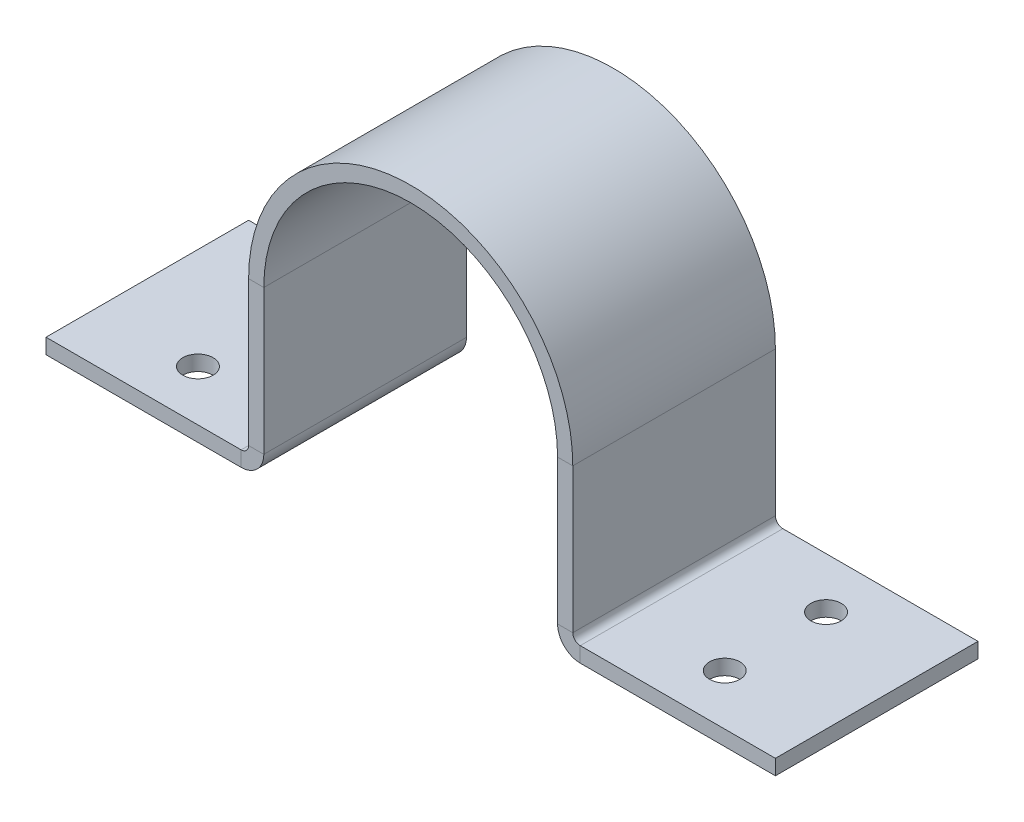
ISO-10303-21;
HEADER;
FILE_DESCRIPTION(('STEP AP214'),'2;1');
FILE_NAME('part.step','',(''),(''),'','','');
FILE_SCHEMA(('AUTOMOTIVE_DESIGN { 1 0 10303 214 1 1 1 1 }'));
ENDSEC;
DATA;
#1=APPLICATION_CONTEXT('core data for automotive mechanical design processes');
#2=APPLICATION_PROTOCOL_DEFINITION('international standard','automotive_design',2000,#1);
#3=PRODUCT_CONTEXT('',#1,'mechanical');
#4=PRODUCT('Part','Part','',(#3));
#5=PRODUCT_RELATED_PRODUCT_CATEGORY('part','',(#4));
#6=PRODUCT_DEFINITION_FORMATION('','',#4);
#7=PRODUCT_DEFINITION_CONTEXT('part definition',#1,'design');
#8=PRODUCT_DEFINITION('design','',#6,#7);
#9=PRODUCT_DEFINITION_SHAPE('','',#8);
#10=(LENGTH_UNIT() NAMED_UNIT(*) SI_UNIT(.MILLI.,.METRE.));
#11=(NAMED_UNIT(*) PLANE_ANGLE_UNIT() SI_UNIT($,.RADIAN.));
#12=(NAMED_UNIT(*) SI_UNIT($,.STERADIAN.) SOLID_ANGLE_UNIT());
#13=UNCERTAINTY_MEASURE_WITH_UNIT(LENGTH_MEASURE(1.E-05),#10,'distance_accuracy_value','');
#14=(GEOMETRIC_REPRESENTATION_CONTEXT(3) GLOBAL_UNCERTAINTY_ASSIGNED_CONTEXT((#13)) GLOBAL_UNIT_ASSIGNED_CONTEXT((#10,
#11,#12)) REPRESENTATION_CONTEXT('',''));
#15=CARTESIAN_POINT('',(0.,0.,0.));
#16=DIRECTION('',(0.,0.,1.));
#17=DIRECTION('',(1.,0.,0.));
#18=AXIS2_PLACEMENT_3D('',#15,#16,#17);
#19=CARTESIAN_POINT('',(17.5726872246696,16.2775330396476,20.));
#20=DIRECTION('',(0.,0.,1.));
#21=DIRECTION('',(1.,0.,0.));
#22=AXIS2_PLACEMENT_3D('',#19,#20,#21);
#23=PLANE('',#22);
#24=DIRECTION('',(-1.,0.,0.));
#25=VECTOR('',#24,1.);
#26=CARTESIAN_POINT('',(17.5726872246696,16.2775330396476,20.));
#27=LINE('',#26,#25);
#28=CARTESIAN_POINT('',(17.5726872246696,16.2775330396476,20.));
#29=VERTEX_POINT('',#28);
#30=CARTESIAN_POINT('',(16.0726872246696,16.2775330396476,20.));
#31=VERTEX_POINT('',#30);
#32=EDGE_CURVE('E11',#29,#31,#27,.T.);
#33=ORIENTED_EDGE('',*,*,#32,.F.);
#34=CARTESIAN_POINT('',(1.5726872246696,16.2775330396476,20.));
#35=DIRECTION('',(0.,0.,-1.));
#36=DIRECTION('',(-1.,0.,0.));
#37=AXIS2_PLACEMENT_3D('',#34,#35,#36);
#38=CIRCLE('',#37,16.);
#39=CARTESIAN_POINT('',(-14.4273127753304,16.2775330396476,20.));
#40=VERTEX_POINT('',#39);
#41=EDGE_CURVE('E305',#40,#29,#38,.T.);
#42=ORIENTED_EDGE('',*,*,#41,.F.);
#43=DIRECTION('',(-1.,0.,0.));
#44=VECTOR('',#43,1.);
#45=CARTESIAN_POINT('',(-12.9273127753304,16.2775330396476,20.));
#46=LINE('',#45,#44);
#47=CARTESIAN_POINT('',(-12.9273127753304,16.2775330396476,20.));
#48=VERTEX_POINT('',#47);
#49=EDGE_CURVE('E47',#48,#40,#46,.T.);
#50=ORIENTED_EDGE('',*,*,#49,.F.);
#51=CARTESIAN_POINT('',(1.5726872246696,16.2775330396476,20.));
#52=DIRECTION('',(0.,0.,1.));
#53=DIRECTION('',(1.,0.,0.));
#54=AXIS2_PLACEMENT_3D('',#51,#52,#53);
#55=CIRCLE('',#54,14.5);
#56=EDGE_CURVE('E172',#48,#31,#55,.F.);
#57=ORIENTED_EDGE('',*,*,#56,.T.);
#58=EDGE_LOOP('',(#33,#42,#50,#57));
#59=FACE_BOUND('',#58,.T.);
#60=ADVANCED_FACE('F39',(#59),#23,.T.);
#61=CARTESIAN_POINT('',(-12.9273127753304,16.2775330396476,20.));
#62=DIRECTION('',(0.,0.,1.));
#63=DIRECTION('',(1.,0.,0.));
#64=AXIS2_PLACEMENT_3D('',#61,#62,#63);
#65=PLANE('',#64);
#66=DIRECTION('',(0.,-1.,0.));
#67=VECTOR('',#66,1.);
#68=CARTESIAN_POINT('',(17.5726872246696,1.27753303964758,20.));
#69=LINE('',#68,#67);
#70=CARTESIAN_POINT('',(17.5726872246696,2.01413303964758,20.));
#71=VERTEX_POINT('',#70);
#72=EDGE_CURVE('E166',#29,#71,#69,.T.);
#73=ORIENTED_EDGE('',*,*,#72,.F.);
#74=ORIENTED_EDGE('',*,*,#32,.T.);
#75=DIRECTION('',(0.,1.,0.));
#76=VECTOR('',#75,1.);
#77=CARTESIAN_POINT('',(16.0726872246696,1.27753303964758,20.));
#78=LINE('',#77,#76);
#79=CARTESIAN_POINT('',(16.0726872246696,2.01413303964758,20.));
#80=VERTEX_POINT('',#79);
#81=EDGE_CURVE('E163',#31,#80,#78,.F.);
#82=ORIENTED_EDGE('',*,*,#81,.T.);
#83=DIRECTION('',(1.,0.,0.));
#84=VECTOR('',#83,1.);
#85=CARTESIAN_POINT('',(16.0726872246696,2.01413303964758,20.));
#86=LINE('',#85,#84);
#87=EDGE_CURVE('E279',#80,#71,#86,.T.);
#88=ORIENTED_EDGE('',*,*,#87,.T.);
#89=EDGE_LOOP('',(#73,#74,#82,#88));
#90=FACE_BOUND('',#89,.T.);
#91=ADVANCED_FACE('F161',(#90),#65,.T.);
#92=CARTESIAN_POINT('',(-14.4273127753304,16.2775330396476,0.));
#93=DIRECTION('',(0.,0.,-1.));
#94=DIRECTION('',(-1.,0.,0.));
#95=AXIS2_PLACEMENT_3D('',#92,#93,#94);
#96=PLANE('',#95);
#97=DIRECTION('',(1.,0.,0.));
#98=VECTOR('',#97,1.);
#99=CARTESIAN_POINT('',(-14.4273127753304,16.2775330396476,0.));
#100=LINE('',#99,#98);
#101=CARTESIAN_POINT('',(-14.4273127753304,16.2775330396476,0.));
#102=VERTEX_POINT('',#101);
#103=CARTESIAN_POINT('',(-12.9273127753304,16.2775330396476,0.));
#104=VERTEX_POINT('',#103);
#105=EDGE_CURVE('E292',#102,#104,#100,.T.);
#106=ORIENTED_EDGE('',*,*,#105,.F.);
#107=CARTESIAN_POINT('',(1.5726872246696,16.2775330396476,0.));
#108=DIRECTION('',(0.,0.,-1.));
#109=DIRECTION('',(-1.,0.,0.));
#110=AXIS2_PLACEMENT_3D('',#107,#108,#109);
#111=CIRCLE('',#110,16.);
#112=CARTESIAN_POINT('',(17.5726872246696,16.2775330396476,0.));
#113=VERTEX_POINT('',#112);
#114=EDGE_CURVE('E212',#102,#113,#111,.T.);
#115=ORIENTED_EDGE('',*,*,#114,.T.);
#116=DIRECTION('',(1.,0.,0.));
#117=VECTOR('',#116,1.);
#118=CARTESIAN_POINT('',(16.0726872246696,16.2775330396476,0.));
#119=LINE('',#118,#117);
#120=CARTESIAN_POINT('',(16.0726872246696,16.2775330396476,0.));
#121=VERTEX_POINT('',#120);
#122=EDGE_CURVE('E290',#121,#113,#119,.T.);
#123=ORIENTED_EDGE('',*,*,#122,.F.);
#124=CARTESIAN_POINT('',(1.5726872246696,16.2775330396476,0.));
#125=DIRECTION('',(0.,0.,1.));
#126=DIRECTION('',(1.,0.,0.));
#127=AXIS2_PLACEMENT_3D('',#124,#125,#126);
#128=CIRCLE('',#127,14.5);
#129=EDGE_CURVE('E184',#104,#121,#128,.F.);
#130=ORIENTED_EDGE('',*,*,#129,.F.);
#131=EDGE_LOOP('',(#106,#115,#123,#130));
#132=FACE_BOUND('',#131,.T.);
#133=ADVANCED_FACE('F339',(#132),#96,.T.);
#134=CARTESIAN_POINT('',(16.0726872246696,16.2775330396476,0.));
#135=DIRECTION('',(0.,0.,-1.));
#136=DIRECTION('',(-1.,0.,0.));
#137=AXIS2_PLACEMENT_3D('',#134,#135,#136);
#138=PLANE('',#137);
#139=DIRECTION('',(0.,1.,0.));
#140=VECTOR('',#139,1.);
#141=CARTESIAN_POINT('',(-14.4273127753304,1.27753303964758,0.));
#142=LINE('',#141,#140);
#143=CARTESIAN_POINT('',(-14.4273127753304,2.01413303964758,0.));
#144=VERTEX_POINT('',#143);
#145=EDGE_CURVE('E215',#144,#102,#142,.T.);
#146=ORIENTED_EDGE('',*,*,#145,.T.);
#147=ORIENTED_EDGE('',*,*,#105,.T.);
#148=DIRECTION('',(0.,1.,0.));
#149=VECTOR('',#148,1.);
#150=CARTESIAN_POINT('',(-12.9273127753304,1.27753303964758,0.));
#151=LINE('',#150,#149);
#152=CARTESIAN_POINT('',(-12.9273127753304,2.01413303964758,0.));
#153=VERTEX_POINT('',#152);
#154=EDGE_CURVE('E233',#153,#104,#151,.T.);
#155=ORIENTED_EDGE('',*,*,#154,.F.);
#156=DIRECTION('',(-1.,0.,0.));
#157=VECTOR('',#156,1.);
#158=CARTESIAN_POINT('',(-12.9273127753304,2.01413303964758,0.));
#159=LINE('',#158,#157);
#160=EDGE_CURVE('E282',#153,#144,#159,.T.);
#161=ORIENTED_EDGE('',*,*,#160,.T.);
#162=EDGE_LOOP('',(#146,#147,#155,#161));
#163=FACE_BOUND('',#162,.T.);
#164=ADVANCED_FACE('F395',(#163),#138,.T.);
#165=CARTESIAN_POINT('',(-14.4273127753304,2.01413303964758,20.));
#166=DIRECTION('',(0.,0.,1.));
#167=DIRECTION('',(1.,0.,0.));
#168=AXIS2_PLACEMENT_3D('',#165,#166,#167);
#169=PLANE('',#168);
#170=DIRECTION('',(1.,0.,0.));
#171=VECTOR('',#170,1.);
#172=CARTESIAN_POINT('',(-14.4273127753304,2.01413303964758,20.));
#173=LINE('',#172,#171);
#174=CARTESIAN_POINT('',(-14.4273127753304,2.01413303964758,20.));
#175=VERTEX_POINT('',#174);
#176=CARTESIAN_POINT('',(-12.9273127753304,2.01413303964758,20.));
#177=VERTEX_POINT('',#176);
#178=EDGE_CURVE('E288',#175,#177,#173,.T.);
#179=ORIENTED_EDGE('',*,*,#178,.F.);
#180=CARTESIAN_POINT('',(-15.1639127753304,2.01413303964758,20.));
#181=DIRECTION('',(0.,0.,-1.));
#182=DIRECTION('',(-1.,0.,0.));
#183=AXIS2_PLACEMENT_3D('',#180,#181,#182);
#184=CIRCLE('',#183,0.7366);
#185=CARTESIAN_POINT('',(-15.1639127753304,1.27753303964758,20.));
#186=VERTEX_POINT('',#185);
#187=EDGE_CURVE('E311',#186,#175,#184,.F.);
#188=ORIENTED_EDGE('',*,*,#187,.F.);
#189=DIRECTION('',(0.,1.,0.));
#190=VECTOR('',#189,1.);
#191=CARTESIAN_POINT('',(-15.1639127753304,-0.222466960352422,20.));
#192=LINE('',#191,#190);
#193=CARTESIAN_POINT('',(-15.1639127753304,-0.222466960352422,20.));
#194=VERTEX_POINT('',#193);
#195=EDGE_CURVE('E286',#194,#186,#192,.T.);
#196=ORIENTED_EDGE('',*,*,#195,.F.);
#197=CARTESIAN_POINT('',(-15.1639127753304,2.01413303964758,20.));
#198=DIRECTION('',(0.,0.,1.));
#199=DIRECTION('',(1.,0.,0.));
#200=AXIS2_PLACEMENT_3D('',#197,#198,#199);
#201=CIRCLE('',#200,2.2366);
#202=EDGE_CURVE('E325',#194,#177,#201,.T.);
#203=ORIENTED_EDGE('',*,*,#202,.T.);
#204=EDGE_LOOP('',(#179,#188,#196,#203));
#205=FACE_BOUND('',#204,.T.);
#206=ADVANCED_FACE('F330',(#205),#169,.T.);
#207=CARTESIAN_POINT('',(-15.1639127753304,-0.222466960352422,20.));
#208=DIRECTION('',(0.,0.,1.));
#209=DIRECTION('',(1.,0.,0.));
#210=AXIS2_PLACEMENT_3D('',#207,#208,#209);
#211=PLANE('',#210);
#212=DIRECTION('',(0.,1.,0.));
#213=VECTOR('',#212,1.);
#214=CARTESIAN_POINT('',(-14.4273127753304,1.27753303964758,20.));
#215=LINE('',#214,#213);
#216=EDGE_CURVE('E298',#175,#40,#215,.T.);
#217=ORIENTED_EDGE('',*,*,#216,.F.);
#218=ORIENTED_EDGE('',*,*,#178,.T.);
#219=DIRECTION('',(0.,1.,0.));
#220=VECTOR('',#219,1.);
#221=CARTESIAN_POINT('',(-12.9273127753304,1.27753303964758,20.));
#222=LINE('',#221,#220);
#223=EDGE_CURVE('E177',#177,#48,#222,.T.);
#224=ORIENTED_EDGE('',*,*,#223,.T.);
#225=ORIENTED_EDGE('',*,*,#49,.T.);
#226=EDGE_LOOP('',(#217,#218,#224,#225));
#227=FACE_BOUND('',#226,.T.);
#228=ADVANCED_FACE('F296',(#227),#211,.T.);
#229=CARTESIAN_POINT('',(-15.1639127753304,1.27753303964758,0.));
#230=DIRECTION('',(0.,0.,-1.));
#231=DIRECTION('',(-1.,0.,0.));
#232=AXIS2_PLACEMENT_3D('',#229,#230,#231);
#233=PLANE('',#232);
#234=DIRECTION('',(0.,-1.,0.));
#235=VECTOR('',#234,1.);
#236=CARTESIAN_POINT('',(-15.1639127753304,1.27753303964758,0.));
#237=LINE('',#236,#235);
#238=CARTESIAN_POINT('',(-15.1639127753304,1.27753303964758,0.));
#239=VERTEX_POINT('',#238);
#240=CARTESIAN_POINT('',(-15.1639127753304,-0.222466960352422,0.));
#241=VERTEX_POINT('',#240);
#242=EDGE_CURVE('E284',#239,#241,#237,.T.);
#243=ORIENTED_EDGE('',*,*,#242,.F.);
#244=CARTESIAN_POINT('',(-15.1639127753304,2.01413303964758,0.));
#245=DIRECTION('',(0.,0.,-1.));
#246=DIRECTION('',(-1.,0.,0.));
#247=AXIS2_PLACEMENT_3D('',#244,#245,#246);
#248=CIRCLE('',#247,0.7366);
#249=EDGE_CURVE('E218',#239,#144,#248,.F.);
#250=ORIENTED_EDGE('',*,*,#249,.T.);
#251=ORIENTED_EDGE('',*,*,#160,.F.);
#252=CARTESIAN_POINT('',(-15.1639127753304,2.01413303964758,0.));
#253=DIRECTION('',(0.,0.,1.));
#254=DIRECTION('',(1.,0.,0.));
#255=AXIS2_PLACEMENT_3D('',#252,#253,#254);
#256=CIRCLE('',#255,2.2366);
#257=EDGE_CURVE('E230',#241,#153,#256,.T.);
#258=ORIENTED_EDGE('',*,*,#257,.F.);
#259=EDGE_LOOP('',(#243,#250,#251,#258));
#260=FACE_BOUND('',#259,.T.);
#261=ADVANCED_FACE('F405',(#260),#233,.T.);
#262=CARTESIAN_POINT('',(-12.9273127753304,2.01413303964758,0.));
#263=DIRECTION('',(0.,0.,-1.));
#264=DIRECTION('',(-1.,0.,0.));
#265=AXIS2_PLACEMENT_3D('',#262,#263,#264);
#266=PLANE('',#265);
#267=DIRECTION('',(1.,0.,0.));
#268=VECTOR('',#267,1.);
#269=CARTESIAN_POINT('',(-34.4273127753304,1.27753303964758,0.));
#270=LINE('',#269,#268);
#271=CARTESIAN_POINT('',(-34.4273127753304,1.27753303964758,0.));
#272=VERTEX_POINT('',#271);
#273=EDGE_CURVE('E221',#272,#239,#270,.T.);
#274=ORIENTED_EDGE('',*,*,#273,.T.);
#275=ORIENTED_EDGE('',*,*,#242,.T.);
#276=DIRECTION('',(1.,0.,0.));
#277=VECTOR('',#276,1.);
#278=CARTESIAN_POINT('',(-34.4273127753304,-0.222466960352422,0.));
#279=LINE('',#278,#277);
#280=CARTESIAN_POINT('',(-34.4273127753304,-0.222466960352422,0.));
#281=VERTEX_POINT('',#280);
#282=EDGE_CURVE('E227',#281,#241,#279,.T.);
#283=ORIENTED_EDGE('',*,*,#282,.F.);
#284=DIRECTION('',(0.,1.,0.));
#285=VECTOR('',#284,1.);
#286=CARTESIAN_POINT('',(-34.4273127753304,-0.222466960352422,0.));
#287=LINE('',#286,#285);
#288=EDGE_CURVE('E224',#281,#272,#287,.T.);
#289=ORIENTED_EDGE('',*,*,#288,.T.);
#290=EDGE_LOOP('',(#274,#275,#283,#289));
#291=FACE_BOUND('',#290,.T.);
#292=ADVANCED_FACE('F386',(#291),#266,.T.);
#293=CARTESIAN_POINT('',(18.3092872246696,1.27753303964758,20.));
#294=DIRECTION('',(0.,0.,1.));
#295=DIRECTION('',(1.,0.,0.));
#296=AXIS2_PLACEMENT_3D('',#293,#294,#295);
#297=PLANE('',#296);
#298=DIRECTION('',(0.,-1.,0.));
#299=VECTOR('',#298,1.);
#300=CARTESIAN_POINT('',(18.3092872246696,1.27753303964758,20.));
#301=LINE('',#300,#299);
#302=CARTESIAN_POINT('',(18.3092872246696,1.27753303964758,20.));
#303=VERTEX_POINT('',#302);
#304=CARTESIAN_POINT('',(18.3092872246696,-0.222466960352422,20.));
#305=VERTEX_POINT('',#304);
#306=EDGE_CURVE('E55',#303,#305,#301,.T.);
#307=ORIENTED_EDGE('',*,*,#306,.F.);
#308=CARTESIAN_POINT('',(18.3092872246696,2.01413303964758,20.));
#309=DIRECTION('',(0.,0.,-1.));
#310=DIRECTION('',(-1.,0.,0.));
#311=AXIS2_PLACEMENT_3D('',#308,#309,#310);
#312=CIRCLE('',#311,0.7366);
#313=EDGE_CURVE('E369',#71,#303,#312,.F.);
#314=ORIENTED_EDGE('',*,*,#313,.F.);
#315=ORIENTED_EDGE('',*,*,#87,.F.);
#316=CARTESIAN_POINT('',(18.3092872246696,2.01413303964758,20.));
#317=DIRECTION('',(0.,0.,1.));
#318=DIRECTION('',(1.,0.,0.));
#319=AXIS2_PLACEMENT_3D('',#316,#317,#318);
#320=CIRCLE('',#319,2.2366);
#321=EDGE_CURVE('E192',#80,#305,#320,.T.);
#322=ORIENTED_EDGE('',*,*,#321,.T.);
#323=EDGE_LOOP('',(#307,#314,#315,#322));
#324=FACE_BOUND('',#323,.T.);
#325=ADVANCED_FACE('F375',(#324),#297,.T.);
#326=CARTESIAN_POINT('',(16.0726872246696,2.01413303964758,20.));
#327=DIRECTION('',(0.,0.,1.));
#328=DIRECTION('',(1.,0.,0.));
#329=AXIS2_PLACEMENT_3D('',#326,#327,#328);
#330=PLANE('',#329);
#331=DIRECTION('',(1.,0.,0.));
#332=VECTOR('',#331,1.);
#333=CARTESIAN_POINT('',(17.5726872246696,1.27753303964758,20.));
#334=LINE('',#333,#332);
#335=CARTESIAN_POINT('',(37.5726872246696,1.27753303964758,20.));
#336=VERTEX_POINT('',#335);
#337=EDGE_CURVE('E367',#303,#336,#334,.T.);
#338=ORIENTED_EDGE('',*,*,#337,.F.);
#339=ORIENTED_EDGE('',*,*,#306,.T.);
#340=DIRECTION('',(1.,0.,0.));
#341=VECTOR('',#340,1.);
#342=CARTESIAN_POINT('',(17.5726872246696,-0.222466960352422,20.));
#343=LINE('',#342,#341);
#344=CARTESIAN_POINT('',(37.5726872246696,-0.222466960352422,20.));
#345=VERTEX_POINT('',#344);
#346=EDGE_CURVE('E121',#305,#345,#343,.T.);
#347=ORIENTED_EDGE('',*,*,#346,.T.);
#348=DIRECTION('',(0.,-1.,0.));
#349=VECTOR('',#348,1.);
#350=CARTESIAN_POINT('',(37.5726872246696,1.27753303964758,20.));
#351=LINE('',#350,#349);
#352=EDGE_CURVE('E365',#336,#345,#351,.T.);
#353=ORIENTED_EDGE('',*,*,#352,.F.);
#354=EDGE_LOOP('',(#338,#339,#347,#353));
#355=FACE_BOUND('',#354,.T.);
#356=ADVANCED_FACE('F378',(#355),#330,.T.);
#357=CARTESIAN_POINT('',(17.5726872246696,2.01413303964758,0.));
#358=DIRECTION('',(0.,0.,-1.));
#359=DIRECTION('',(-1.,0.,0.));
#360=AXIS2_PLACEMENT_3D('',#357,#358,#359);
#361=PLANE('',#360);
#362=DIRECTION('',(-1.,0.,0.));
#363=VECTOR('',#362,1.);
#364=CARTESIAN_POINT('',(17.5726872246696,2.01413303964758,0.));
#365=LINE('',#364,#363);
#366=CARTESIAN_POINT('',(17.5726872246696,2.01413303964758,0.));
#367=VERTEX_POINT('',#366);
#368=CARTESIAN_POINT('',(16.0726872246696,2.01413303964758,0.));
#369=VERTEX_POINT('',#368);
#370=EDGE_CURVE('E108',#367,#369,#365,.T.);
#371=ORIENTED_EDGE('',*,*,#370,.F.);
#372=CARTESIAN_POINT('',(18.3092872246696,2.01413303964758,0.));
#373=DIRECTION('',(0.,0.,-1.));
#374=DIRECTION('',(-1.,0.,0.));
#375=AXIS2_PLACEMENT_3D('',#372,#373,#374);
#376=CIRCLE('',#375,0.7366);
#377=CARTESIAN_POINT('',(18.3092872246696,1.27753303964758,0.));
#378=VERTEX_POINT('',#377);
#379=EDGE_CURVE('E208',#367,#378,#376,.F.);
#380=ORIENTED_EDGE('',*,*,#379,.T.);
#381=DIRECTION('',(0.,1.,0.));
#382=VECTOR('',#381,1.);
#383=CARTESIAN_POINT('',(18.3092872246696,-0.222466960352422,0.));
#384=LINE('',#383,#382);
#385=CARTESIAN_POINT('',(18.3092872246696,-0.222466960352422,0.));
#386=VERTEX_POINT('',#385);
#387=EDGE_CURVE('E115',#386,#378,#384,.T.);
#388=ORIENTED_EDGE('',*,*,#387,.F.);
#389=CARTESIAN_POINT('',(18.3092872246696,2.01413303964758,0.));
#390=DIRECTION('',(0.,0.,1.));
#391=DIRECTION('',(1.,0.,0.));
#392=AXIS2_PLACEMENT_3D('',#389,#390,#391);
#393=CIRCLE('',#392,2.2366);
#394=EDGE_CURVE('E239',#369,#386,#393,.T.);
#395=ORIENTED_EDGE('',*,*,#394,.F.);
#396=EDGE_LOOP('',(#371,#380,#388,#395));
#397=FACE_BOUND('',#396,.T.);
#398=ADVANCED_FACE('F352',(#397),#361,.T.);
#399=CARTESIAN_POINT('',(18.3092872246696,-0.222466960352422,0.));
#400=DIRECTION('',(0.,0.,-1.));
#401=DIRECTION('',(-1.,0.,0.));
#402=AXIS2_PLACEMENT_3D('',#399,#400,#401);
#403=PLANE('',#402);
#404=DIRECTION('',(0.,-1.,0.));
#405=VECTOR('',#404,1.);
#406=CARTESIAN_POINT('',(17.5726872246696,1.27753303964758,0.));
#407=LINE('',#406,#405);
#408=EDGE_CURVE('E210',#113,#367,#407,.T.);
#409=ORIENTED_EDGE('',*,*,#408,.T.);
#410=ORIENTED_EDGE('',*,*,#370,.T.);
#411=DIRECTION('',(0.,1.,0.));
#412=VECTOR('',#411,1.);
#413=CARTESIAN_POINT('',(16.0726872246696,1.27753303964758,0.));
#414=LINE('',#413,#412);
#415=EDGE_CURVE('E237',#121,#369,#414,.F.);
#416=ORIENTED_EDGE('',*,*,#415,.F.);
#417=ORIENTED_EDGE('',*,*,#122,.T.);
#418=EDGE_LOOP('',(#409,#410,#416,#417));
#419=FACE_BOUND('',#418,.T.);
#420=ADVANCED_FACE('F340',(#419),#403,.T.);
#421=CARTESIAN_POINT('',(17.5726872246696,-0.222466960352422,20.));
#422=DIRECTION('',(0.,1.,0.));
#423=DIRECTION('',(0.,0.,1.));
#424=AXIS2_PLACEMENT_3D('',#421,#422,#423);
#425=PLANE('',#424);
#426=CARTESIAN_POINT('',(27.5726872246696,-0.222466960352422,5.));
#427=DIRECTION('',(0.,1.,0.));
#428=DIRECTION('',(0.,0.,1.));
#429=AXIS2_PLACEMENT_3D('',#426,#427,#428);
#430=CIRCLE('',#429,1.5);
#431=CARTESIAN_POINT('',(27.5726872246696,-0.222466960352422,6.5));
#432=VERTEX_POINT('',#431);
#433=EDGE_CURVE('E753',#432,#432,#430,.T.);
#434=ORIENTED_EDGE('',*,*,#433,.T.);
#435=EDGE_LOOP('',(#434));
#436=FACE_BOUND('',#435,.T.);
#437=CARTESIAN_POINT('',(27.5726872246696,-0.222466960352422,15.));
#438=DIRECTION('',(0.,1.,0.));
#439=DIRECTION('',(0.,0.,1.));
#440=AXIS2_PLACEMENT_3D('',#437,#438,#439);
#441=CIRCLE('',#440,1.5);
#442=CARTESIAN_POINT('',(27.5726872246696,-0.222466960352422,16.5));
#443=VERTEX_POINT('',#442);
#444=EDGE_CURVE('E757',#443,#443,#441,.T.);
#445=ORIENTED_EDGE('',*,*,#444,.T.);
#446=EDGE_LOOP('',(#445));
#447=FACE_BOUND('',#446,.T.);
#448=DIRECTION('',(1.,0.,0.));
#449=VECTOR('',#448,1.);
#450=CARTESIAN_POINT('',(17.5726872246696,-0.222466960352422,0.));
#451=LINE('',#450,#449);
#452=CARTESIAN_POINT('',(37.5726872246696,-0.222466960352422,0.));
#453=VERTEX_POINT('',#452);
#454=EDGE_CURVE('E198',#386,#453,#451,.T.);
#455=ORIENTED_EDGE('',*,*,#454,.T.);
#456=DIRECTION('',(0.,0.,-1.));
#457=VECTOR('',#456,1.);
#458=CARTESIAN_POINT('',(37.5726872246696,-0.222466960352422,20.));
#459=LINE('',#458,#457);
#460=EDGE_CURVE('E275',#345,#453,#459,.T.);
#461=ORIENTED_EDGE('',*,*,#460,.F.);
#462=ORIENTED_EDGE('',*,*,#346,.F.);
#463=DIRECTION('',(0.,0.,-1.));
#464=VECTOR('',#463,1.);
#465=CARTESIAN_POINT('',(18.3092872246696,-0.222466960352422,20.));
#466=LINE('',#465,#464);
#467=EDGE_CURVE('E194',#305,#386,#466,.T.);
#468=ORIENTED_EDGE('',*,*,#467,.T.);
#469=EDGE_LOOP('',(#455,#461,#462,#468));
#470=FACE_BOUND('',#469,.T.);
#471=ADVANCED_FACE('F358',(#436,#447,#470),#425,.F.);
#472=CARTESIAN_POINT('',(37.5726872246696,1.27753303964758,20.));
#473=DIRECTION('',(1.,0.,0.));
#474=DIRECTION('',(0.,0.,-1.));
#475=AXIS2_PLACEMENT_3D('',#472,#473,#474);
#476=PLANE('',#475);
#477=DIRECTION('',(0.,-1.,0.));
#478=VECTOR('',#477,1.);
#479=CARTESIAN_POINT('',(37.5726872246696,1.27753303964758,0.));
#480=LINE('',#479,#478);
#481=CARTESIAN_POINT('',(37.5726872246696,1.27753303964758,0.));
#482=VERTEX_POINT('',#481);
#483=EDGE_CURVE('E201',#482,#453,#480,.T.);
#484=ORIENTED_EDGE('',*,*,#483,.F.);
#485=DIRECTION('',(0.,0.,-1.));
#486=VECTOR('',#485,1.);
#487=CARTESIAN_POINT('',(37.5726872246696,1.27753303964758,20.));
#488=LINE('',#487,#486);
#489=EDGE_CURVE('E273',#336,#482,#488,.T.);
#490=ORIENTED_EDGE('',*,*,#489,.F.);
#491=ORIENTED_EDGE('',*,*,#352,.T.);
#492=ORIENTED_EDGE('',*,*,#460,.T.);
#493=EDGE_LOOP('',(#484,#490,#491,#492));
#494=FACE_BOUND('',#493,.T.);
#495=ADVANCED_FACE('F363',(#494),#476,.T.);
#496=CARTESIAN_POINT('',(17.5726872246696,1.27753303964758,20.));
#497=DIRECTION('',(0.,1.,0.));
#498=DIRECTION('',(0.,0.,1.));
#499=AXIS2_PLACEMENT_3D('',#496,#497,#498);
#500=PLANE('',#499);
#501=CARTESIAN_POINT('',(27.5726872246696,1.27753303964758,5.));
#502=DIRECTION('',(0.,1.,0.));
#503=DIRECTION('',(0.,0.,1.));
#504=AXIS2_PLACEMENT_3D('',#501,#502,#503);
#505=CIRCLE('',#504,1.5);
#506=CARTESIAN_POINT('',(27.5726872246696,1.27753303964758,6.5));
#507=VERTEX_POINT('',#506);
#508=EDGE_CURVE('E756',#507,#507,#505,.T.);
#509=ORIENTED_EDGE('',*,*,#508,.F.);
#510=EDGE_LOOP('',(#509));
#511=FACE_BOUND('',#510,.T.);
#512=CARTESIAN_POINT('',(27.5726872246696,1.27753303964758,15.));
#513=DIRECTION('',(0.,1.,0.));
#514=DIRECTION('',(0.,0.,1.));
#515=AXIS2_PLACEMENT_3D('',#512,#513,#514);
#516=CIRCLE('',#515,1.5);
#517=CARTESIAN_POINT('',(27.5726872246696,1.27753303964758,16.5));
#518=VERTEX_POINT('',#517);
#519=EDGE_CURVE('E762',#518,#518,#516,.T.);
#520=ORIENTED_EDGE('',*,*,#519,.F.);
#521=EDGE_LOOP('',(#520));
#522=FACE_BOUND('',#521,.T.);
#523=DIRECTION('',(1.,0.,0.));
#524=VECTOR('',#523,1.);
#525=CARTESIAN_POINT('',(17.5726872246696,1.27753303964758,0.));
#526=LINE('',#525,#524);
#527=EDGE_CURVE('E205',#378,#482,#526,.T.);
#528=ORIENTED_EDGE('',*,*,#527,.F.);
#529=DIRECTION('',(0.,0.,-1.));
#530=VECTOR('',#529,1.);
#531=CARTESIAN_POINT('',(18.3092872246696,1.27753303964758,20.));
#532=LINE('',#531,#530);
#533=EDGE_CURVE('E270',#303,#378,#532,.T.);
#534=ORIENTED_EDGE('',*,*,#533,.F.);
#535=ORIENTED_EDGE('',*,*,#337,.T.);
#536=ORIENTED_EDGE('',*,*,#489,.T.);
#537=EDGE_LOOP('',(#528,#534,#535,#536));
#538=FACE_BOUND('',#537,.T.);
#539=ADVANCED_FACE('F377',(#511,#522,#538),#500,.T.);
#540=CARTESIAN_POINT('',(18.3092872246696,2.01413303964758,20.));
#541=DIRECTION('',(0.,0.,-1.));
#542=DIRECTION('',(-1.,0.,0.));
#543=AXIS2_PLACEMENT_3D('',#540,#541,#542);
#544=CYLINDRICAL_SURFACE('',#543,0.7366);
#545=ORIENTED_EDGE('',*,*,#379,.F.);
#546=DIRECTION('',(0.,0.,-1.));
#547=VECTOR('',#546,1.);
#548=CARTESIAN_POINT('',(17.5726872246696,2.01413303964758,20.));
#549=LINE('',#548,#547);
#550=EDGE_CURVE('E267',#71,#367,#549,.T.);
#551=ORIENTED_EDGE('',*,*,#550,.F.);
#552=ORIENTED_EDGE('',*,*,#313,.T.);
#553=ORIENTED_EDGE('',*,*,#533,.T.);
#554=EDGE_LOOP('',(#545,#551,#552,#553));
#555=FACE_BOUND('',#554,.T.);
#556=ADVANCED_FACE('F349',(#555),#544,.F.);
#557=CARTESIAN_POINT('',(17.5726872246696,1.27753303964758,20.));
#558=DIRECTION('',(1.,0.,0.));
#559=DIRECTION('',(0.,0.,-1.));
#560=AXIS2_PLACEMENT_3D('',#557,#558,#559);
#561=PLANE('',#560);
#562=ORIENTED_EDGE('',*,*,#408,.F.);
#563=DIRECTION('',(0.,0.,-1.));
#564=VECTOR('',#563,1.);
#565=CARTESIAN_POINT('',(17.5726872246696,16.2775330396476,20.));
#566=LINE('',#565,#564);
#567=EDGE_CURVE('E264',#29,#113,#566,.T.);
#568=ORIENTED_EDGE('',*,*,#567,.F.);
#569=ORIENTED_EDGE('',*,*,#72,.T.);
#570=ORIENTED_EDGE('',*,*,#550,.T.);
#571=EDGE_LOOP('',(#562,#568,#569,#570));
#572=FACE_BOUND('',#571,.T.);
#573=ADVANCED_FACE('F343',(#572),#561,.T.);
#574=CARTESIAN_POINT('',(1.5726872246696,16.2775330396476,20.));
#575=DIRECTION('',(0.,0.,-1.));
#576=DIRECTION('',(-1.,0.,0.));
#577=AXIS2_PLACEMENT_3D('',#574,#575,#576);
#578=CYLINDRICAL_SURFACE('',#577,16.);
#579=ORIENTED_EDGE('',*,*,#114,.F.);
#580=DIRECTION('',(0.,0.,-1.));
#581=VECTOR('',#580,1.);
#582=CARTESIAN_POINT('',(-14.4273127753304,16.2775330396476,20.));
#583=LINE('',#582,#581);
#584=EDGE_CURVE('E261',#40,#102,#583,.T.);
#585=ORIENTED_EDGE('',*,*,#584,.F.);
#586=ORIENTED_EDGE('',*,*,#41,.T.);
#587=ORIENTED_EDGE('',*,*,#567,.T.);
#588=EDGE_LOOP('',(#579,#585,#586,#587));
#589=FACE_BOUND('',#588,.T.);
#590=ADVANCED_FACE('F304',(#589),#578,.T.);
#591=CARTESIAN_POINT('',(-14.4273127753304,1.27753303964758,20.));
#592=DIRECTION('',(-1.,0.,0.));
#593=DIRECTION('',(0.,0.,1.));
#594=AXIS2_PLACEMENT_3D('',#591,#592,#593);
#595=PLANE('',#594);
#596=ORIENTED_EDGE('',*,*,#145,.F.);
#597=DIRECTION('',(0.,0.,-1.));
#598=VECTOR('',#597,1.);
#599=CARTESIAN_POINT('',(-14.4273127753304,2.01413303964758,20.));
#600=LINE('',#599,#598);
#601=EDGE_CURVE('E258',#175,#144,#600,.T.);
#602=ORIENTED_EDGE('',*,*,#601,.F.);
#603=ORIENTED_EDGE('',*,*,#216,.T.);
#604=ORIENTED_EDGE('',*,*,#584,.T.);
#605=EDGE_LOOP('',(#596,#602,#603,#604));
#606=FACE_BOUND('',#605,.T.);
#607=ADVANCED_FACE('F310',(#606),#595,.T.);
#608=CARTESIAN_POINT('',(-15.1639127753304,2.01413303964758,20.));
#609=DIRECTION('',(0.,0.,-1.));
#610=DIRECTION('',(-1.,0.,0.));
#611=AXIS2_PLACEMENT_3D('',#608,#609,#610);
#612=CYLINDRICAL_SURFACE('',#611,0.7366);
#613=ORIENTED_EDGE('',*,*,#249,.F.);
#614=DIRECTION('',(0.,0.,-1.));
#615=VECTOR('',#614,1.);
#616=CARTESIAN_POINT('',(-15.1639127753304,1.27753303964758,20.));
#617=LINE('',#616,#615);
#618=EDGE_CURVE('E255',#186,#239,#617,.T.);
#619=ORIENTED_EDGE('',*,*,#618,.F.);
#620=ORIENTED_EDGE('',*,*,#187,.T.);
#621=ORIENTED_EDGE('',*,*,#601,.T.);
#622=EDGE_LOOP('',(#613,#619,#620,#621));
#623=FACE_BOUND('',#622,.T.);
#624=ADVANCED_FACE('F422',(#623),#612,.F.);
#625=CARTESIAN_POINT('',(-34.4273127753304,1.27753303964758,20.));
#626=DIRECTION('',(0.,1.,0.));
#627=DIRECTION('',(0.,0.,1.));
#628=AXIS2_PLACEMENT_3D('',#625,#626,#627);
#629=PLANE('',#628);
#630=CARTESIAN_POINT('',(-24.4273127753304,1.27753303964758,5.));
#631=DIRECTION('',(0.,1.,0.));
#632=DIRECTION('',(0.,0.,1.));
#633=AXIS2_PLACEMENT_3D('',#630,#631,#632);
#634=CIRCLE('',#633,1.5);
#635=CARTESIAN_POINT('',(-24.4273127753304,1.27753303964758,6.5));
#636=VERTEX_POINT('',#635);
#637=EDGE_CURVE('E769',#636,#636,#634,.T.);
#638=ORIENTED_EDGE('',*,*,#637,.F.);
#639=EDGE_LOOP('',(#638));
#640=FACE_BOUND('',#639,.T.);
#641=CARTESIAN_POINT('',(-24.4273127753304,1.27753303964758,15.));
#642=DIRECTION('',(0.,1.,0.));
#643=DIRECTION('',(0.,0.,1.));
#644=AXIS2_PLACEMENT_3D('',#641,#642,#643);
#645=CIRCLE('',#644,1.5);
#646=CARTESIAN_POINT('',(-24.4273127753304,1.27753303964758,16.5));
#647=VERTEX_POINT('',#646);
#648=EDGE_CURVE('E759',#647,#647,#645,.T.);
#649=ORIENTED_EDGE('',*,*,#648,.F.);
#650=EDGE_LOOP('',(#649));
#651=FACE_BOUND('',#650,.T.);
#652=ORIENTED_EDGE('',*,*,#273,.F.);
#653=DIRECTION('',(0.,0.,-1.));
#654=VECTOR('',#653,1.);
#655=CARTESIAN_POINT('',(-34.4273127753304,1.27753303964758,20.));
#656=LINE('',#655,#654);
#657=CARTESIAN_POINT('',(-34.4273127753304,1.27753303964758,20.));
#658=VERTEX_POINT('',#657);
#659=EDGE_CURVE('E253',#658,#272,#656,.T.);
#660=ORIENTED_EDGE('',*,*,#659,.F.);
#661=DIRECTION('',(1.,0.,0.));
#662=VECTOR('',#661,1.);
#663=CARTESIAN_POINT('',(-34.4273127753304,1.27753303964758,20.));
#664=LINE('',#663,#662);
#665=EDGE_CURVE('E313',#658,#186,#664,.T.);
#666=ORIENTED_EDGE('',*,*,#665,.T.);
#667=ORIENTED_EDGE('',*,*,#618,.T.);
#668=EDGE_LOOP('',(#652,#660,#666,#667));
#669=FACE_BOUND('',#668,.T.);
#670=ADVANCED_FACE('F417',(#640,#651,#669),#629,.T.);
#671=CARTESIAN_POINT('',(-34.4273127753304,-0.222466960352422,20.));
#672=DIRECTION('',(-1.,0.,0.));
#673=DIRECTION('',(0.,0.,1.));
#674=AXIS2_PLACEMENT_3D('',#671,#672,#673);
#675=PLANE('',#674);
#676=ORIENTED_EDGE('',*,*,#288,.F.);
#677=DIRECTION('',(0.,0.,-1.));
#678=VECTOR('',#677,1.);
#679=CARTESIAN_POINT('',(-34.4273127753304,-0.222466960352422,20.));
#680=LINE('',#679,#678);
#681=CARTESIAN_POINT('',(-34.4273127753304,-0.222466960352422,20.));
#682=VERTEX_POINT('',#681);
#683=EDGE_CURVE('E251',#682,#281,#680,.T.);
#684=ORIENTED_EDGE('',*,*,#683,.F.);
#685=DIRECTION('',(0.,1.,0.));
#686=VECTOR('',#685,1.);
#687=CARTESIAN_POINT('',(-34.4273127753304,-0.222466960352422,20.));
#688=LINE('',#687,#686);
#689=EDGE_CURVE('E319',#682,#658,#688,.T.);
#690=ORIENTED_EDGE('',*,*,#689,.T.);
#691=ORIENTED_EDGE('',*,*,#659,.T.);
#692=EDGE_LOOP('',(#676,#684,#690,#691));
#693=FACE_BOUND('',#692,.T.);
#694=ADVANCED_FACE('F429',(#693),#675,.T.);
#695=CARTESIAN_POINT('',(-34.4273127753304,-0.222466960352422,20.));
#696=DIRECTION('',(0.,1.,0.));
#697=DIRECTION('',(0.,0.,1.));
#698=AXIS2_PLACEMENT_3D('',#695,#696,#697);
#699=PLANE('',#698);
#700=CARTESIAN_POINT('',(-24.4273127753304,-0.222466960352422,5.));
#701=DIRECTION('',(0.,1.,0.));
#702=DIRECTION('',(0.,0.,1.));
#703=AXIS2_PLACEMENT_3D('',#700,#701,#702);
#704=CIRCLE('',#703,1.5);
#705=CARTESIAN_POINT('',(-24.4273127753304,-0.222466960352422,6.5));
#706=VERTEX_POINT('',#705);
#707=EDGE_CURVE('E202',#706,#706,#704,.T.);
#708=ORIENTED_EDGE('',*,*,#707,.T.);
#709=EDGE_LOOP('',(#708));
#710=FACE_BOUND('',#709,.T.);
#711=CARTESIAN_POINT('',(-24.4273127753304,-0.222466960352422,15.));
#712=DIRECTION('',(0.,1.,0.));
#713=DIRECTION('',(0.,0.,1.));
#714=AXIS2_PLACEMENT_3D('',#711,#712,#713);
#715=CIRCLE('',#714,1.5);
#716=CARTESIAN_POINT('',(-24.4273127753304,-0.222466960352422,16.5));
#717=VERTEX_POINT('',#716);
#718=EDGE_CURVE('E772',#717,#717,#715,.T.);
#719=ORIENTED_EDGE('',*,*,#718,.T.);
#720=EDGE_LOOP('',(#719));
#721=FACE_BOUND('',#720,.T.);
#722=ORIENTED_EDGE('',*,*,#282,.T.);
#723=DIRECTION('',(0.,0.,-1.));
#724=VECTOR('',#723,1.);
#725=CARTESIAN_POINT('',(-15.1639127753304,-0.222466960352422,20.));
#726=LINE('',#725,#724);
#727=EDGE_CURVE('E248',#194,#241,#726,.T.);
#728=ORIENTED_EDGE('',*,*,#727,.F.);
#729=DIRECTION('',(1.,0.,0.));
#730=VECTOR('',#729,1.);
#731=CARTESIAN_POINT('',(-34.4273127753304,-0.222466960352422,20.));
#732=LINE('',#731,#730);
#733=EDGE_CURVE('E322',#682,#194,#732,.T.);
#734=ORIENTED_EDGE('',*,*,#733,.F.);
#735=ORIENTED_EDGE('',*,*,#683,.T.);
#736=EDGE_LOOP('',(#722,#728,#734,#735));
#737=FACE_BOUND('',#736,.T.);
#738=ADVANCED_FACE('F500',(#710,#721,#737),#699,.F.);
#739=CARTESIAN_POINT('',(-15.1639127753304,2.01413303964758,20.));
#740=DIRECTION('',(0.,0.,-1.));
#741=DIRECTION('',(-1.,0.,0.));
#742=AXIS2_PLACEMENT_3D('',#739,#740,#741);
#743=CYLINDRICAL_SURFACE('',#742,2.2366);
#744=ORIENTED_EDGE('',*,*,#257,.T.);
#745=DIRECTION('',(0.,0.,-1.));
#746=VECTOR('',#745,1.);
#747=CARTESIAN_POINT('',(-12.9273127753304,2.01413303964758,20.));
#748=LINE('',#747,#746);
#749=EDGE_CURVE('E245',#177,#153,#748,.T.);
#750=ORIENTED_EDGE('',*,*,#749,.F.);
#751=ORIENTED_EDGE('',*,*,#202,.F.);
#752=ORIENTED_EDGE('',*,*,#727,.T.);
#753=EDGE_LOOP('',(#744,#750,#751,#752));
#754=FACE_BOUND('',#753,.T.);
#755=ADVANCED_FACE('F333',(#754),#743,.T.);
#756=CARTESIAN_POINT('',(-12.9273127753304,1.27753303964758,20.));
#757=DIRECTION('',(-1.,0.,0.));
#758=DIRECTION('',(0.,0.,1.));
#759=AXIS2_PLACEMENT_3D('',#756,#757,#758);
#760=PLANE('',#759);
#761=ORIENTED_EDGE('',*,*,#154,.T.);
#762=DIRECTION('',(0.,0.,-1.));
#763=VECTOR('',#762,1.);
#764=CARTESIAN_POINT('',(-12.9273127753304,16.2775330396476,20.));
#765=LINE('',#764,#763);
#766=EDGE_CURVE('E186',#48,#104,#765,.T.);
#767=ORIENTED_EDGE('',*,*,#766,.F.);
#768=ORIENTED_EDGE('',*,*,#223,.F.);
#769=ORIENTED_EDGE('',*,*,#749,.T.);
#770=EDGE_LOOP('',(#761,#767,#768,#769));
#771=FACE_BOUND('',#770,.T.);
#772=ADVANCED_FACE('F337',(#771),#760,.F.);
#773=CARTESIAN_POINT('',(1.5726872246696,16.2775330396476,20.));
#774=DIRECTION('',(0.,0.,-1.));
#775=DIRECTION('',(-1.,0.,0.));
#776=AXIS2_PLACEMENT_3D('',#773,#774,#775);
#777=CYLINDRICAL_SURFACE('',#776,14.5);
#778=ORIENTED_EDGE('',*,*,#129,.T.);
#779=DIRECTION('',(0.,0.,-1.));
#780=VECTOR('',#779,1.);
#781=CARTESIAN_POINT('',(16.0726872246696,16.2775330396476,20.));
#782=LINE('',#781,#780);
#783=EDGE_CURVE('E181',#31,#121,#782,.T.);
#784=ORIENTED_EDGE('',*,*,#783,.F.);
#785=ORIENTED_EDGE('',*,*,#56,.F.);
#786=ORIENTED_EDGE('',*,*,#766,.T.);
#787=EDGE_LOOP('',(#778,#784,#785,#786));
#788=FACE_BOUND('',#787,.T.);
#789=ADVANCED_FACE('F182',(#788),#777,.F.);
#790=CARTESIAN_POINT('',(16.0726872246696,1.27753303964758,20.));
#791=DIRECTION('',(1.,0.,0.));
#792=DIRECTION('',(0.,0.,-1.));
#793=AXIS2_PLACEMENT_3D('',#790,#791,#792);
#794=PLANE('',#793);
#795=ORIENTED_EDGE('',*,*,#415,.T.);
#796=DIRECTION('',(0.,0.,-1.));
#797=VECTOR('',#796,1.);
#798=CARTESIAN_POINT('',(16.0726872246696,2.01413303964758,20.));
#799=LINE('',#798,#797);
#800=EDGE_CURVE('E187',#80,#369,#799,.T.);
#801=ORIENTED_EDGE('',*,*,#800,.F.);
#802=ORIENTED_EDGE('',*,*,#81,.F.);
#803=ORIENTED_EDGE('',*,*,#783,.T.);
#804=EDGE_LOOP('',(#795,#801,#802,#803));
#805=FACE_BOUND('',#804,.T.);
#806=ADVANCED_FACE('F189',(#805),#794,.F.);
#807=CARTESIAN_POINT('',(18.3092872246696,2.01413303964758,20.));
#808=DIRECTION('',(0.,0.,-1.));
#809=DIRECTION('',(-1.,0.,0.));
#810=AXIS2_PLACEMENT_3D('',#807,#808,#809);
#811=CYLINDRICAL_SURFACE('',#810,2.2366);
#812=ORIENTED_EDGE('',*,*,#394,.T.);
#813=ORIENTED_EDGE('',*,*,#467,.F.);
#814=ORIENTED_EDGE('',*,*,#321,.F.);
#815=ORIENTED_EDGE('',*,*,#800,.T.);
#816=EDGE_LOOP('',(#812,#813,#814,#815));
#817=FACE_BOUND('',#816,.T.);
#818=ADVANCED_FACE('F355',(#817),#811,.T.);
#819=CARTESIAN_POINT('',(18.3092872246696,2.01413303964758,20.));
#820=DIRECTION('',(0.,0.,-1.));
#821=DIRECTION('',(-1.,0.,0.));
#822=AXIS2_PLACEMENT_3D('',#819,#820,#821);
#823=PLANE('',#822);
#824=ORIENTED_EDGE('',*,*,#733,.T.);
#825=ORIENTED_EDGE('',*,*,#195,.T.);
#826=ORIENTED_EDGE('',*,*,#665,.F.);
#827=ORIENTED_EDGE('',*,*,#689,.F.);
#828=EDGE_LOOP('',(#824,#825,#826,#827));
#829=FACE_BOUND('',#828,.T.);
#830=ADVANCED_FACE('F548',(#829),#823,.F.);
#831=CARTESIAN_POINT('',(18.3092872246696,2.01413303964758,0.));
#832=DIRECTION('',(0.,0.,-1.));
#833=DIRECTION('',(-1.,0.,0.));
#834=AXIS2_PLACEMENT_3D('',#831,#832,#833);
#835=PLANE('',#834);
#836=ORIENTED_EDGE('',*,*,#454,.F.);
#837=ORIENTED_EDGE('',*,*,#387,.T.);
#838=ORIENTED_EDGE('',*,*,#527,.T.);
#839=ORIENTED_EDGE('',*,*,#483,.T.);
#840=EDGE_LOOP('',(#836,#837,#838,#839));
#841=FACE_BOUND('',#840,.T.);
#842=ADVANCED_FACE('F360',(#841),#835,.T.);
#843=CARTESIAN_POINT('',(-24.4273127753304,-0.222466960352422,15.));
#844=DIRECTION('',(0.,1.,0.));
#845=DIRECTION('',(0.,0.,1.));
#846=AXIS2_PLACEMENT_3D('',#843,#844,#845);
#847=CYLINDRICAL_SURFACE('',#846,1.5);
#848=ORIENTED_EDGE('',*,*,#718,.F.);
#849=EDGE_LOOP('',(#848));
#850=FACE_BOUND('',#849,.T.);
#851=ORIENTED_EDGE('',*,*,#648,.T.);
#852=EDGE_LOOP('',(#851));
#853=FACE_BOUND('',#852,.T.);
#854=ADVANCED_FACE('F568',(#850,#853),#847,.F.);
#855=CARTESIAN_POINT('',(-24.4273127753304,-0.222466960352422,5.));
#856=DIRECTION('',(0.,1.,0.));
#857=DIRECTION('',(0.,0.,1.));
#858=AXIS2_PLACEMENT_3D('',#855,#856,#857);
#859=CYLINDRICAL_SURFACE('',#858,1.5);
#860=ORIENTED_EDGE('',*,*,#707,.F.);
#861=EDGE_LOOP('',(#860));
#862=FACE_BOUND('',#861,.T.);
#863=ORIENTED_EDGE('',*,*,#637,.T.);
#864=EDGE_LOOP('',(#863));
#865=FACE_BOUND('',#864,.T.);
#866=ADVANCED_FACE('F591',(#862,#865),#859,.F.);
#867=CARTESIAN_POINT('',(27.5726872246696,-0.222466960352422,15.));
#868=DIRECTION('',(0.,1.,0.));
#869=DIRECTION('',(0.,0.,1.));
#870=AXIS2_PLACEMENT_3D('',#867,#868,#869);
#871=CYLINDRICAL_SURFACE('',#870,1.5);
#872=ORIENTED_EDGE('',*,*,#444,.F.);
#873=EDGE_LOOP('',(#872));
#874=FACE_BOUND('',#873,.T.);
#875=ORIENTED_EDGE('',*,*,#519,.T.);
#876=EDGE_LOOP('',(#875));
#877=FACE_BOUND('',#876,.T.);
#878=ADVANCED_FACE('F601',(#874,#877),#871,.F.);
#879=CARTESIAN_POINT('',(27.5726872246696,-0.222466960352422,5.));
#880=DIRECTION('',(0.,1.,0.));
#881=DIRECTION('',(0.,0.,1.));
#882=AXIS2_PLACEMENT_3D('',#879,#880,#881);
#883=CYLINDRICAL_SURFACE('',#882,1.5);
#884=ORIENTED_EDGE('',*,*,#433,.F.);
#885=EDGE_LOOP('',(#884));
#886=FACE_BOUND('',#885,.T.);
#887=ORIENTED_EDGE('',*,*,#508,.T.);
#888=EDGE_LOOP('',(#887));
#889=FACE_BOUND('',#888,.T.);
#890=ADVANCED_FACE('F612',(#886,#889),#883,.F.);
#891=CLOSED_SHELL('',(#60,#91,#133,#164,#206,#228,#261,#292,#325,#356,#398,#420,#471,#495,#539,
#556,#573,#590,#607,#624,#670,#694,#738,#755,#772,#789,#806,#818,#830,#842,#854,#866,#878,#890));
#892=MANIFOLD_SOLID_BREP('B2',#891);
#893=ADVANCED_BREP_SHAPE_REPRESENTATION('',(#18,#892),#14);
#894=SHAPE_DEFINITION_REPRESENTATION(#9,#893);
ENDSEC;
END-ISO-10303-21;
